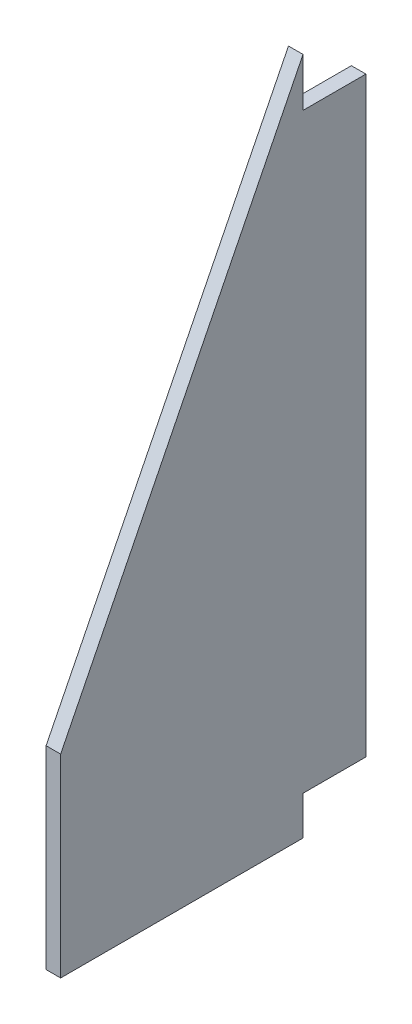
ISO-10303-21;
HEADER;
FILE_DESCRIPTION(('STEP AP214'),'2;1');
FILE_NAME('part.step','',(''),(''),'','','');
FILE_SCHEMA(('AUTOMOTIVE_DESIGN { 1 0 10303 214 1 1 1 1 }'));
ENDSEC;
DATA;
#1=APPLICATION_CONTEXT('core data for automotive mechanical design processes');
#2=APPLICATION_PROTOCOL_DEFINITION('international standard','automotive_design',2000,#1);
#3=PRODUCT_CONTEXT('',#1,'mechanical');
#4=PRODUCT('Part','Part','',(#3));
#5=PRODUCT_RELATED_PRODUCT_CATEGORY('part','',(#4));
#6=PRODUCT_DEFINITION_FORMATION('','',#4);
#7=PRODUCT_DEFINITION_CONTEXT('part definition',#1,'design');
#8=PRODUCT_DEFINITION('design','',#6,#7);
#9=PRODUCT_DEFINITION_SHAPE('','',#8);
#10=(LENGTH_UNIT() NAMED_UNIT(*) SI_UNIT(.MILLI.,.METRE.));
#11=(NAMED_UNIT(*) PLANE_ANGLE_UNIT() SI_UNIT($,.RADIAN.));
#12=(NAMED_UNIT(*) SI_UNIT($,.STERADIAN.) SOLID_ANGLE_UNIT());
#13=UNCERTAINTY_MEASURE_WITH_UNIT(LENGTH_MEASURE(1.E-05),#10,'distance_accuracy_value','');
#14=(GEOMETRIC_REPRESENTATION_CONTEXT(3) GLOBAL_UNCERTAINTY_ASSIGNED_CONTEXT((#13)) GLOBAL_UNIT_ASSIGNED_CONTEXT((#10,
#11,#12)) REPRESENTATION_CONTEXT('',''));
#15=CARTESIAN_POINT('',(0.,0.,0.));
#16=DIRECTION('',(0.,0.,1.));
#17=DIRECTION('',(1.,0.,0.));
#18=AXIS2_PLACEMENT_3D('',#15,#16,#17);
#19=CARTESIAN_POINT('',(1.5,8.,33.9725));
#20=DIRECTION('',(0.,0.,1.));
#21=DIRECTION('',(1.,0.,0.));
#22=AXIS2_PLACEMENT_3D('',#19,#20,#21);
#23=PLANE('',#22);
#24=DIRECTION('',(0.,1.,0.));
#25=VECTOR('',#24,1.);
#26=CARTESIAN_POINT('',(-1.5,8.,33.9725));
#27=LINE('',#26,#25);
#28=CARTESIAN_POINT('',(-1.5,0.,33.9725));
#29=VERTEX_POINT('',#28);
#30=CARTESIAN_POINT('',(-1.5,8.,33.9725));
#31=VERTEX_POINT('',#30);
#32=EDGE_CURVE('E140',#29,#31,#27,.T.);
#33=ORIENTED_EDGE('',*,*,#32,.T.);
#34=DIRECTION('',(-1.,0.,0.));
#35=VECTOR('',#34,1.);
#36=CARTESIAN_POINT('',(1.5,8.,33.9725));
#37=LINE('',#36,#35);
#38=CARTESIAN_POINT('',(1.5,8.,33.9725));
#39=VERTEX_POINT('',#38);
#40=EDGE_CURVE('E11',#39,#31,#37,.T.);
#41=ORIENTED_EDGE('',*,*,#40,.F.);
#42=DIRECTION('',(0.,1.,0.));
#43=VECTOR('',#42,1.);
#44=CARTESIAN_POINT('',(1.5,8.,33.9725));
#45=LINE('',#44,#43);
#46=CARTESIAN_POINT('',(1.5,0.,33.9725));
#47=VERTEX_POINT('',#46);
#48=EDGE_CURVE('E162',#47,#39,#45,.T.);
#49=ORIENTED_EDGE('',*,*,#48,.F.);
#50=DIRECTION('',(-1.,0.,0.));
#51=VECTOR('',#50,1.);
#52=CARTESIAN_POINT('',(1.5,0.,33.9725));
#53=LINE('',#52,#51);
#54=EDGE_CURVE('E136',#47,#29,#53,.T.);
#55=ORIENTED_EDGE('',*,*,#54,.T.);
#56=EDGE_LOOP('',(#33,#41,#49,#55));
#57=FACE_BOUND('',#56,.T.);
#58=ADVANCED_FACE('F39',(#57),#23,.F.);
#59=CARTESIAN_POINT('',(1.5,8.,33.9725));
#60=DIRECTION('',(0.,1.,0.));
#61=DIRECTION('',(0.,0.,1.));
#62=AXIS2_PLACEMENT_3D('',#59,#60,#61);
#63=PLANE('',#62);
#64=DIRECTION('',(0.,0.,-1.));
#65=VECTOR('',#64,1.);
#66=CARTESIAN_POINT('',(-1.5,8.,33.9725));
#67=LINE('',#66,#65);
#68=CARTESIAN_POINT('',(-1.5,8.,21.));
#69=VERTEX_POINT('',#68);
#70=EDGE_CURVE('E144',#31,#69,#67,.T.);
#71=ORIENTED_EDGE('',*,*,#70,.T.);
#72=DIRECTION('',(-1.,0.,0.));
#73=VECTOR('',#72,1.);
#74=CARTESIAN_POINT('',(1.5,8.,21.));
#75=LINE('',#74,#73);
#76=CARTESIAN_POINT('',(1.5,8.,21.));
#77=VERTEX_POINT('',#76);
#78=EDGE_CURVE('E48',#77,#69,#75,.T.);
#79=ORIENTED_EDGE('',*,*,#78,.F.);
#80=DIRECTION('',(0.,0.,-1.));
#81=VECTOR('',#80,1.);
#82=CARTESIAN_POINT('',(1.5,8.,33.9725));
#83=LINE('',#82,#81);
#84=EDGE_CURVE('E99',#39,#77,#83,.T.);
#85=ORIENTED_EDGE('',*,*,#84,.F.);
#86=ORIENTED_EDGE('',*,*,#40,.T.);
#87=EDGE_LOOP('',(#71,#79,#85,#86));
#88=FACE_BOUND('',#87,.T.);
#89=ADVANCED_FACE('F208',(#88),#63,.F.);
#90=CARTESIAN_POINT('',(1.5,8.,21.));
#91=DIRECTION('',(0.,0.,1.));
#92=DIRECTION('',(1.,0.,0.));
#93=AXIS2_PLACEMENT_3D('',#90,#91,#92);
#94=PLANE('',#93);
#95=DIRECTION('',(0.,1.,0.));
#96=VECTOR('',#95,1.);
#97=CARTESIAN_POINT('',(-1.5,8.,21.));
#98=LINE('',#97,#96);
#99=CARTESIAN_POINT('',(-1.5,130.,21.));
#100=VERTEX_POINT('',#99);
#101=EDGE_CURVE('E147',#69,#100,#98,.T.);
#102=ORIENTED_EDGE('',*,*,#101,.T.);
#103=DIRECTION('',(-1.,0.,0.));
#104=VECTOR('',#103,1.);
#105=CARTESIAN_POINT('',(1.5,130.,21.));
#106=LINE('',#105,#104);
#107=CARTESIAN_POINT('',(1.5,130.,21.));
#108=VERTEX_POINT('',#107);
#109=EDGE_CURVE('E173',#108,#100,#106,.T.);
#110=ORIENTED_EDGE('',*,*,#109,.F.);
#111=DIRECTION('',(0.,1.,0.));
#112=VECTOR('',#111,1.);
#113=CARTESIAN_POINT('',(1.5,8.,21.));
#114=LINE('',#113,#112);
#115=EDGE_CURVE('E183',#77,#108,#114,.T.);
#116=ORIENTED_EDGE('',*,*,#115,.F.);
#117=ORIENTED_EDGE('',*,*,#78,.T.);
#118=EDGE_LOOP('',(#102,#110,#116,#117));
#119=FACE_BOUND('',#118,.T.);
#120=ADVANCED_FACE('F181',(#119),#94,.F.);
#121=CARTESIAN_POINT('',(1.5,130.,21.));
#122=DIRECTION('',(0.,-1.,0.));
#123=DIRECTION('',(0.,0.,-1.));
#124=AXIS2_PLACEMENT_3D('',#121,#122,#123);
#125=PLANE('',#124);
#126=DIRECTION('',(0.,0.,1.));
#127=VECTOR('',#126,1.);
#128=CARTESIAN_POINT('',(-1.5,130.,21.));
#129=LINE('',#128,#127);
#130=CARTESIAN_POINT('',(-1.5,130.,33.9725));
#131=VERTEX_POINT('',#130);
#132=EDGE_CURVE('E150',#100,#131,#129,.T.);
#133=ORIENTED_EDGE('',*,*,#132,.T.);
#134=DIRECTION('',(-1.,0.,0.));
#135=VECTOR('',#134,1.);
#136=CARTESIAN_POINT('',(1.5,130.,33.9725));
#137=LINE('',#136,#135);
#138=CARTESIAN_POINT('',(1.5,130.,33.9725));
#139=VERTEX_POINT('',#138);
#140=EDGE_CURVE('E169',#139,#131,#137,.T.);
#141=ORIENTED_EDGE('',*,*,#140,.F.);
#142=DIRECTION('',(0.,0.,1.));
#143=VECTOR('',#142,1.);
#144=CARTESIAN_POINT('',(1.5,130.,21.));
#145=LINE('',#144,#143);
#146=EDGE_CURVE('E196',#108,#139,#145,.T.);
#147=ORIENTED_EDGE('',*,*,#146,.F.);
#148=ORIENTED_EDGE('',*,*,#109,.T.);
#149=EDGE_LOOP('',(#133,#141,#147,#148));
#150=FACE_BOUND('',#149,.T.);
#151=ADVANCED_FACE('F191',(#150),#125,.F.);
#152=CARTESIAN_POINT('',(1.5,140.,33.9725));
#153=DIRECTION('',(0.,0.,1.));
#154=DIRECTION('',(0.,-1.,0.));
#155=AXIS2_PLACEMENT_3D('',#152,#153,#154);
#156=PLANE('',#155);
#157=DIRECTION('',(0.,1.,0.));
#158=VECTOR('',#157,1.);
#159=CARTESIAN_POINT('',(-1.5,140.,33.9725));
#160=LINE('',#159,#158);
#161=CARTESIAN_POINT('',(-1.5,140.,33.9725));
#162=VERTEX_POINT('',#161);
#163=EDGE_CURVE('E153',#131,#162,#160,.T.);
#164=ORIENTED_EDGE('',*,*,#163,.T.);
#165=DIRECTION('',(-1.,0.,0.));
#166=VECTOR('',#165,1.);
#167=CARTESIAN_POINT('',(1.5,140.,33.9725));
#168=LINE('',#167,#166);
#169=CARTESIAN_POINT('',(1.5,140.,33.9725));
#170=VERTEX_POINT('',#169);
#171=EDGE_CURVE('E129',#170,#162,#168,.T.);
#172=ORIENTED_EDGE('',*,*,#171,.F.);
#173=DIRECTION('',(0.,1.,0.));
#174=VECTOR('',#173,1.);
#175=CARTESIAN_POINT('',(1.5,140.,33.9725));
#176=LINE('',#175,#174);
#177=EDGE_CURVE('E118',#139,#170,#176,.T.);
#178=ORIENTED_EDGE('',*,*,#177,.F.);
#179=ORIENTED_EDGE('',*,*,#140,.T.);
#180=EDGE_LOOP('',(#164,#172,#178,#179));
#181=FACE_BOUND('',#180,.T.);
#182=ADVANCED_FACE('F194',(#181),#156,.F.);
#183=CARTESIAN_POINT('',(1.5,40.,83.9725));
#184=DIRECTION('',(0.,-0.447213595499958,-0.894427190999916));
#185=DIRECTION('',(0.,0.894427190999916,-0.447213595499958));
#186=AXIS2_PLACEMENT_3D('',#183,#184,#185);
#187=PLANE('',#186);
#188=DIRECTION('',(0.,-0.894427190999916,0.447213595499958));
#189=VECTOR('',#188,1.);
#190=CARTESIAN_POINT('',(-1.5,40.,83.9725));
#191=LINE('',#190,#189);
#192=CARTESIAN_POINT('',(-1.5,40.,83.9725));
#193=VERTEX_POINT('',#192);
#194=EDGE_CURVE('E127',#162,#193,#191,.T.);
#195=ORIENTED_EDGE('',*,*,#194,.T.);
#196=DIRECTION('',(-1.,0.,0.));
#197=VECTOR('',#196,1.);
#198=CARTESIAN_POINT('',(1.5,40.,83.9725));
#199=LINE('',#198,#197);
#200=CARTESIAN_POINT('',(1.5,40.,83.9725));
#201=VERTEX_POINT('',#200);
#202=EDGE_CURVE('E124',#201,#193,#199,.T.);
#203=ORIENTED_EDGE('',*,*,#202,.F.);
#204=DIRECTION('',(0.,-0.894427190999916,0.447213595499958));
#205=VECTOR('',#204,1.);
#206=CARTESIAN_POINT('',(1.5,40.,83.9725));
#207=LINE('',#206,#205);
#208=EDGE_CURVE('E112',#170,#201,#207,.T.);
#209=ORIENTED_EDGE('',*,*,#208,.F.);
#210=ORIENTED_EDGE('',*,*,#171,.T.);
#211=EDGE_LOOP('',(#195,#203,#209,#210));
#212=FACE_BOUND('',#211,.T.);
#213=ADVANCED_FACE('F125',(#212),#187,.F.);
#214=CARTESIAN_POINT('',(1.5,0.,83.9725));
#215=DIRECTION('',(0.,0.,-1.));
#216=DIRECTION('',(-1.,0.,0.));
#217=AXIS2_PLACEMENT_3D('',#214,#215,#216);
#218=PLANE('',#217);
#219=DIRECTION('',(0.,-1.,0.));
#220=VECTOR('',#219,1.);
#221=CARTESIAN_POINT('',(-1.5,0.,83.9725));
#222=LINE('',#221,#220);
#223=CARTESIAN_POINT('',(-1.5,0.,83.9725));
#224=VERTEX_POINT('',#223);
#225=EDGE_CURVE('E85',#193,#224,#222,.T.);
#226=ORIENTED_EDGE('',*,*,#225,.T.);
#227=DIRECTION('',(-1.,0.,0.));
#228=VECTOR('',#227,1.);
#229=CARTESIAN_POINT('',(1.5,0.,83.9725));
#230=LINE('',#229,#228);
#231=CARTESIAN_POINT('',(1.5,0.,83.9725));
#232=VERTEX_POINT('',#231);
#233=EDGE_CURVE('E130',#232,#224,#230,.T.);
#234=ORIENTED_EDGE('',*,*,#233,.F.);
#235=DIRECTION('',(0.,-1.,0.));
#236=VECTOR('',#235,1.);
#237=CARTESIAN_POINT('',(1.5,0.,83.9725));
#238=LINE('',#237,#236);
#239=EDGE_CURVE('E116',#201,#232,#238,.T.);
#240=ORIENTED_EDGE('',*,*,#239,.F.);
#241=ORIENTED_EDGE('',*,*,#202,.T.);
#242=EDGE_LOOP('',(#226,#234,#240,#241));
#243=FACE_BOUND('',#242,.T.);
#244=ADVANCED_FACE('F132',(#243),#218,.F.);
#245=CARTESIAN_POINT('',(1.5,0.,33.9725));
#246=DIRECTION('',(0.,1.,0.));
#247=DIRECTION('',(0.,0.,1.));
#248=AXIS2_PLACEMENT_3D('',#245,#246,#247);
#249=PLANE('',#248);
#250=DIRECTION('',(0.,0.,-1.));
#251=VECTOR('',#250,1.);
#252=CARTESIAN_POINT('',(-1.5,0.,33.9725));
#253=LINE('',#252,#251);
#254=EDGE_CURVE('E91',#224,#29,#253,.T.);
#255=ORIENTED_EDGE('',*,*,#254,.T.);
#256=ORIENTED_EDGE('',*,*,#54,.F.);
#257=DIRECTION('',(0.,0.,-1.));
#258=VECTOR('',#257,1.);
#259=CARTESIAN_POINT('',(1.5,0.,33.9725));
#260=LINE('',#259,#258);
#261=EDGE_CURVE('E56',#232,#47,#260,.T.);
#262=ORIENTED_EDGE('',*,*,#261,.F.);
#263=ORIENTED_EDGE('',*,*,#233,.T.);
#264=EDGE_LOOP('',(#255,#256,#262,#263));
#265=FACE_BOUND('',#264,.T.);
#266=ADVANCED_FACE('F224',(#265),#249,.F.);
#267=CARTESIAN_POINT('',(1.5,0.,0.));
#268=DIRECTION('',(-1.,0.,0.));
#269=DIRECTION('',(0.,0.,1.));
#270=AXIS2_PLACEMENT_3D('',#267,#268,#269);
#271=PLANE('',#270);
#272=ORIENTED_EDGE('',*,*,#48,.T.);
#273=ORIENTED_EDGE('',*,*,#84,.T.);
#274=ORIENTED_EDGE('',*,*,#115,.T.);
#275=ORIENTED_EDGE('',*,*,#146,.T.);
#276=ORIENTED_EDGE('',*,*,#177,.T.);
#277=ORIENTED_EDGE('',*,*,#208,.T.);
#278=ORIENTED_EDGE('',*,*,#239,.T.);
#279=ORIENTED_EDGE('',*,*,#261,.T.);
#280=EDGE_LOOP('',(#272,#273,#274,#275,#276,#277,#278,#279));
#281=FACE_BOUND('',#280,.T.);
#282=ADVANCED_FACE('F114',(#281),#271,.F.);
#283=CARTESIAN_POINT('',(-1.5,0.,0.));
#284=DIRECTION('',(-1.,0.,0.));
#285=DIRECTION('',(0.,0.,1.));
#286=AXIS2_PLACEMENT_3D('',#283,#284,#285);
#287=PLANE('',#286);
#288=ORIENTED_EDGE('',*,*,#32,.F.);
#289=ORIENTED_EDGE('',*,*,#254,.F.);
#290=ORIENTED_EDGE('',*,*,#225,.F.);
#291=ORIENTED_EDGE('',*,*,#194,.F.);
#292=ORIENTED_EDGE('',*,*,#163,.F.);
#293=ORIENTED_EDGE('',*,*,#132,.F.);
#294=ORIENTED_EDGE('',*,*,#101,.F.);
#295=ORIENTED_EDGE('',*,*,#70,.F.);
#296=EDGE_LOOP('',(#288,#289,#290,#291,#292,#293,#294,#295));
#297=FACE_BOUND('',#296,.T.);
#298=ADVANCED_FACE('F187',(#297),#287,.T.);
#299=CLOSED_SHELL('',(#58,#89,#120,#151,#182,#213,#244,#266,#282,#298));
#300=MANIFOLD_SOLID_BREP('B2',#299);
#301=ADVANCED_BREP_SHAPE_REPRESENTATION('',(#18,#300),#14);
#302=SHAPE_DEFINITION_REPRESENTATION(#9,#301);
ENDSEC;
END-ISO-10303-21;
